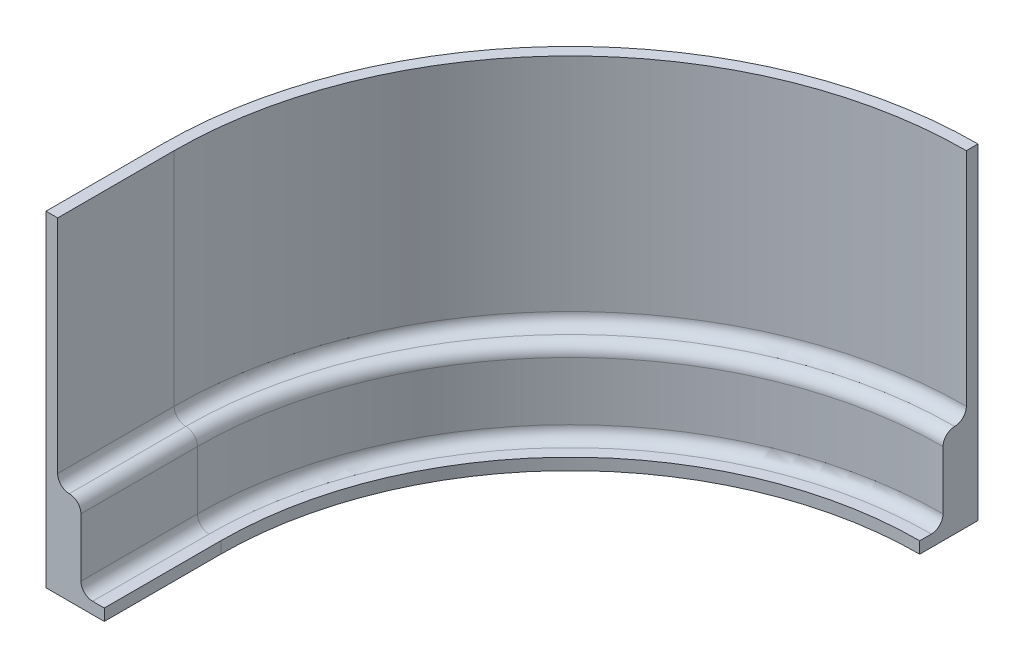
ISO-10303-21;
HEADER;
FILE_DESCRIPTION(('STEP AP214'),'2;1');
FILE_NAME('part.step','',(''),(''),'','','');
FILE_SCHEMA(('AUTOMOTIVE_DESIGN { 1 0 10303 214 1 1 1 1 }'));
ENDSEC;
DATA;
#1=APPLICATION_CONTEXT('core data for automotive mechanical design processes');
#2=APPLICATION_PROTOCOL_DEFINITION('international standard','automotive_design',2000,#1);
#3=PRODUCT_CONTEXT('',#1,'mechanical');
#4=PRODUCT('Part','Part','',(#3));
#5=PRODUCT_RELATED_PRODUCT_CATEGORY('part','',(#4));
#6=PRODUCT_DEFINITION_FORMATION('','',#4);
#7=PRODUCT_DEFINITION_CONTEXT('part definition',#1,'design');
#8=PRODUCT_DEFINITION('design','',#6,#7);
#9=PRODUCT_DEFINITION_SHAPE('','',#8);
#10=(LENGTH_UNIT() NAMED_UNIT(*) SI_UNIT(.MILLI.,.METRE.));
#11=(NAMED_UNIT(*) PLANE_ANGLE_UNIT() SI_UNIT($,.RADIAN.));
#12=(NAMED_UNIT(*) SI_UNIT($,.STERADIAN.) SOLID_ANGLE_UNIT());
#13=UNCERTAINTY_MEASURE_WITH_UNIT(LENGTH_MEASURE(1.E-05),#10,'distance_accuracy_value','');
#14=(GEOMETRIC_REPRESENTATION_CONTEXT(3) GLOBAL_UNCERTAINTY_ASSIGNED_CONTEXT((#13)) GLOBAL_UNIT_ASSIGNED_CONTEXT((#10,
#11,#12)) REPRESENTATION_CONTEXT('',''));
#15=CARTESIAN_POINT('',(0.,0.,0.));
#16=DIRECTION('',(0.,0.,1.));
#17=DIRECTION('',(1.,0.,0.));
#18=AXIS2_PLACEMENT_3D('',#15,#16,#17);
#19=CARTESIAN_POINT('',(150.,5.,0.));
#20=DIRECTION('',(0.,-1.,0.));
#21=DIRECTION('',(0.,0.,-1.));
#22=AXIS2_PLACEMENT_3D('',#19,#20,#21);
#23=PLANE('',#22);
#24=CARTESIAN_POINT('',(150.,5.,0.));
#25=DIRECTION('',(0.,-1.,0.));
#26=DIRECTION('',(0.,0.,-1.));
#27=AXIS2_PLACEMENT_3D('',#24,#25,#26);
#28=CIRCLE('',#27,155.);
#29=CARTESIAN_POINT('',(150.,5.,-155.));
#30=VERTEX_POINT('',#29);
#31=CARTESIAN_POINT('',(-4.99999999999997,5.,0.));
#32=VERTEX_POINT('',#31);
#33=EDGE_CURVE('E188',#30,#32,#28,.F.);
#34=ORIENTED_EDGE('',*,*,#33,.T.);
#35=DIRECTION('',(0.,0.,-1.));
#36=VECTOR('',#35,1.);
#37=CARTESIAN_POINT('',(-5.,5.,50.));
#38=LINE('',#37,#36);
#39=CARTESIAN_POINT('',(-5.,5.,50.));
#40=VERTEX_POINT('',#39);
#41=EDGE_CURVE('E186',#32,#40,#38,.F.);
#42=ORIENTED_EDGE('',*,*,#41,.T.);
#43=DIRECTION('',(1.,0.,0.));
#44=VECTOR('',#43,1.);
#45=CARTESIAN_POINT('',(-25.,5.,50.));
#46=LINE('',#45,#44);
#47=CARTESIAN_POINT('',(0.,5.,50.));
#48=VERTEX_POINT('',#47);
#49=EDGE_CURVE('E227',#40,#48,#46,.T.);
#50=ORIENTED_EDGE('',*,*,#49,.T.);
#51=DIRECTION('',(0.,0.,-1.));
#52=VECTOR('',#51,1.);
#53=CARTESIAN_POINT('',(0.,5.,50.));
#54=LINE('',#53,#52);
#55=CARTESIAN_POINT('',(0.,5.,0.));
#56=VERTEX_POINT('',#55);
#57=EDGE_CURVE('E210',#48,#56,#54,.T.);
#58=ORIENTED_EDGE('',*,*,#57,.T.);
#59=CARTESIAN_POINT('',(150.,5.,0.));
#60=DIRECTION('',(0.,-1.,0.));
#61=DIRECTION('',(0.,0.,-1.));
#62=AXIS2_PLACEMENT_3D('',#59,#60,#61);
#63=CIRCLE('',#62,150.);
#64=CARTESIAN_POINT('',(150.,5.,-150.));
#65=VERTEX_POINT('',#64);
#66=EDGE_CURVE('E213',#56,#65,#63,.T.);
#67=ORIENTED_EDGE('',*,*,#66,.T.);
#68=DIRECTION('',(0.,0.,-1.));
#69=VECTOR('',#68,1.);
#70=CARTESIAN_POINT('',(150.,5.,-150.));
#71=LINE('',#70,#69);
#72=EDGE_CURVE('E229',#65,#30,#71,.T.);
#73=ORIENTED_EDGE('',*,*,#72,.T.);
#74=EDGE_LOOP('',(#34,#42,#50,#58,#67,#73));
#75=FACE_BOUND('',#74,.T.);
#76=ADVANCED_FACE('F33',(#75),#23,.F.);
#77=CARTESIAN_POINT('',(150.,5.,0.));
#78=DIRECTION('',(0.,-1.,0.));
#79=DIRECTION('',(0.,0.,-1.));
#80=AXIS2_PLACEMENT_3D('',#77,#78,#79);
#81=CYLINDRICAL_SURFACE('',#80,150.);
#82=CARTESIAN_POINT('',(150.,0.,0.));
#83=DIRECTION('',(0.,-1.,0.));
#84=DIRECTION('',(0.,0.,-1.));
#85=AXIS2_PLACEMENT_3D('',#82,#83,#84);
#86=CIRCLE('',#85,150.);
#87=CARTESIAN_POINT('',(0.,0.,0.));
#88=VERTEX_POINT('',#87);
#89=CARTESIAN_POINT('',(150.,0.,-150.));
#90=VERTEX_POINT('',#89);
#91=EDGE_CURVE('E222',#88,#90,#86,.T.);
#92=ORIENTED_EDGE('',*,*,#91,.T.);
#93=DIRECTION('',(0.,-1.,0.));
#94=VECTOR('',#93,1.);
#95=CARTESIAN_POINT('',(150.,5.,-150.));
#96=LINE('',#95,#94);
#97=EDGE_CURVE('E194',#65,#90,#96,.T.);
#98=ORIENTED_EDGE('',*,*,#97,.F.);
#99=ORIENTED_EDGE('',*,*,#66,.F.);
#100=DIRECTION('',(0.,-1.,0.));
#101=VECTOR('',#100,1.);
#102=CARTESIAN_POINT('',(0.,5.,0.));
#103=LINE('',#102,#101);
#104=EDGE_CURVE('E207',#56,#88,#103,.T.);
#105=ORIENTED_EDGE('',*,*,#104,.T.);
#106=EDGE_LOOP('',(#92,#98,#99,#105));
#107=FACE_BOUND('',#106,.T.);
#108=ADVANCED_FACE('F292',(#107),#81,.F.);
#109=CARTESIAN_POINT('',(150.,5.,-150.));
#110=DIRECTION('',(-1.,0.,0.));
#111=DIRECTION('',(0.,0.,1.));
#112=AXIS2_PLACEMENT_3D('',#109,#110,#111);
#113=PLANE('',#112);
#114=DIRECTION('',(0.,-1.,0.));
#115=VECTOR('',#114,1.);
#116=CARTESIAN_POINT('',(150.,140.,-170.));
#117=LINE('',#116,#115);
#118=CARTESIAN_POINT('',(150.,140.,-170.));
#119=VERTEX_POINT('',#118);
#120=CARTESIAN_POINT('',(150.,45.,-170.));
#121=VERTEX_POINT('',#120);
#122=EDGE_CURVE('E248',#119,#121,#117,.T.);
#123=ORIENTED_EDGE('',*,*,#122,.T.);
#124=CARTESIAN_POINT('',(150.,45.,-165.));
#125=DIRECTION('',(-1.,0.,0.));
#126=DIRECTION('',(0.,0.,1.));
#127=AXIS2_PLACEMENT_3D('',#124,#125,#126);
#128=CIRCLE('',#127,5.);
#129=CARTESIAN_POINT('',(150.,40.,-165.));
#130=VERTEX_POINT('',#129);
#131=EDGE_CURVE('E11',#121,#130,#128,.T.);
#132=ORIENTED_EDGE('',*,*,#131,.T.);
#133=CARTESIAN_POINT('',(150.,35.,-165.));
#134=DIRECTION('',(-1.,0.,0.));
#135=DIRECTION('',(0.,0.,1.));
#136=AXIS2_PLACEMENT_3D('',#133,#134,#135);
#137=CIRCLE('',#136,5.);
#138=CARTESIAN_POINT('',(150.,35.,-160.));
#139=VERTEX_POINT('',#138);
#140=EDGE_CURVE('E156',#130,#139,#137,.F.);
#141=ORIENTED_EDGE('',*,*,#140,.T.);
#142=DIRECTION('',(0.,-1.,0.));
#143=VECTOR('',#142,1.);
#144=CARTESIAN_POINT('',(150.,40.,-160.));
#145=LINE('',#144,#143);
#146=CARTESIAN_POINT('',(150.,10.,-160.));
#147=VERTEX_POINT('',#146);
#148=EDGE_CURVE('E239',#139,#147,#145,.T.);
#149=ORIENTED_EDGE('',*,*,#148,.T.);
#150=CARTESIAN_POINT('',(150.,10.,-155.));
#151=DIRECTION('',(-1.,0.,0.));
#152=DIRECTION('',(0.,0.,1.));
#153=AXIS2_PLACEMENT_3D('',#150,#151,#152);
#154=CIRCLE('',#153,5.);
#155=EDGE_CURVE('E43',#147,#30,#154,.T.);
#156=ORIENTED_EDGE('',*,*,#155,.T.);
#157=ORIENTED_EDGE('',*,*,#72,.F.);
#158=ORIENTED_EDGE('',*,*,#97,.T.);
#159=DIRECTION('',(0.,0.,-1.));
#160=VECTOR('',#159,1.);
#161=CARTESIAN_POINT('',(150.,0.,-150.));
#162=LINE('',#161,#160);
#163=CARTESIAN_POINT('',(150.,0.,-175.));
#164=VERTEX_POINT('',#163);
#165=EDGE_CURVE('E220',#90,#164,#162,.T.);
#166=ORIENTED_EDGE('',*,*,#165,.T.);
#167=DIRECTION('',(0.,-1.,0.));
#168=VECTOR('',#167,1.);
#169=CARTESIAN_POINT('',(150.,5.,-175.));
#170=LINE('',#169,#168);
#171=CARTESIAN_POINT('',(150.,140.,-175.));
#172=VERTEX_POINT('',#171);
#173=EDGE_CURVE('E197',#172,#164,#170,.T.);
#174=ORIENTED_EDGE('',*,*,#173,.F.);
#175=DIRECTION('',(0.,0.,-1.));
#176=VECTOR('',#175,1.);
#177=CARTESIAN_POINT('',(150.,140.,-170.));
#178=LINE('',#177,#176);
#179=EDGE_CURVE('E250',#119,#172,#178,.T.);
#180=ORIENTED_EDGE('',*,*,#179,.F.);
#181=EDGE_LOOP('',(#123,#132,#141,#149,#156,#157,#158,#166,#174,#180));
#182=FACE_BOUND('',#181,.T.);
#183=ADVANCED_FACE('F290',(#182),#113,.F.);
#184=CARTESIAN_POINT('',(150.,5.,0.));
#185=DIRECTION('',(0.,-1.,0.));
#186=DIRECTION('',(0.,0.,-1.));
#187=AXIS2_PLACEMENT_3D('',#184,#185,#186);
#188=CYLINDRICAL_SURFACE('',#187,175.);
#189=CARTESIAN_POINT('',(150.,0.,0.));
#190=DIRECTION('',(0.,1.,0.));
#191=DIRECTION('',(0.,0.,-1.));
#192=AXIS2_PLACEMENT_3D('',#189,#190,#191);
#193=CIRCLE('',#192,175.);
#194=CARTESIAN_POINT('',(-25.,0.,0.));
#195=VERTEX_POINT('',#194);
#196=EDGE_CURVE('E218',#164,#195,#193,.T.);
#197=ORIENTED_EDGE('',*,*,#196,.T.);
#198=DIRECTION('',(0.,-1.,0.));
#199=VECTOR('',#198,1.);
#200=CARTESIAN_POINT('',(-25.,5.,0.));
#201=LINE('',#200,#199);
#202=CARTESIAN_POINT('',(-25.,140.,0.));
#203=VERTEX_POINT('',#202);
#204=EDGE_CURVE('E136',#203,#195,#201,.T.);
#205=ORIENTED_EDGE('',*,*,#204,.F.);
#206=CARTESIAN_POINT('',(150.,140.,0.));
#207=DIRECTION('',(0.,1.,0.));
#208=DIRECTION('',(0.,0.,1.));
#209=AXIS2_PLACEMENT_3D('',#206,#207,#208);
#210=CIRCLE('',#209,175.);
#211=EDGE_CURVE('E170',#172,#203,#210,.T.);
#212=ORIENTED_EDGE('',*,*,#211,.F.);
#213=ORIENTED_EDGE('',*,*,#173,.T.);
#214=EDGE_LOOP('',(#197,#205,#212,#213));
#215=FACE_BOUND('',#214,.T.);
#216=ADVANCED_FACE('F267',(#215),#188,.T.);
#217=CARTESIAN_POINT('',(-25.,5.,0.));
#218=DIRECTION('',(1.,0.,0.));
#219=DIRECTION('',(0.,0.,-1.));
#220=AXIS2_PLACEMENT_3D('',#217,#218,#219);
#221=PLANE('',#220);
#222=DIRECTION('',(0.,0.,1.));
#223=VECTOR('',#222,1.);
#224=CARTESIAN_POINT('',(-25.,0.,0.));
#225=LINE('',#224,#223);
#226=CARTESIAN_POINT('',(-25.,0.,50.));
#227=VERTEX_POINT('',#226);
#228=EDGE_CURVE('E216',#195,#227,#225,.T.);
#229=ORIENTED_EDGE('',*,*,#228,.T.);
#230=DIRECTION('',(0.,-1.,0.));
#231=VECTOR('',#230,1.);
#232=CARTESIAN_POINT('',(-25.,5.,50.));
#233=LINE('',#232,#231);
#234=CARTESIAN_POINT('',(-25.,140.,50.));
#235=VERTEX_POINT('',#234);
#236=EDGE_CURVE('E201',#235,#227,#233,.T.);
#237=ORIENTED_EDGE('',*,*,#236,.F.);
#238=DIRECTION('',(0.,0.,1.));
#239=VECTOR('',#238,1.);
#240=CARTESIAN_POINT('',(-25.,140.,0.));
#241=LINE('',#240,#239);
#242=EDGE_CURVE('E259',#203,#235,#241,.T.);
#243=ORIENTED_EDGE('',*,*,#242,.F.);
#244=ORIENTED_EDGE('',*,*,#204,.T.);
#245=EDGE_LOOP('',(#229,#237,#243,#244));
#246=FACE_BOUND('',#245,.T.);
#247=ADVANCED_FACE('F276',(#246),#221,.F.);
#248=CARTESIAN_POINT('',(-25.,5.,50.));
#249=DIRECTION('',(0.,0.,-1.));
#250=DIRECTION('',(-1.,0.,0.));
#251=AXIS2_PLACEMENT_3D('',#248,#249,#250);
#252=PLANE('',#251);
#253=DIRECTION('',(0.,-1.,0.));
#254=VECTOR('',#253,1.);
#255=CARTESIAN_POINT('',(-10.,40.,50.));
#256=LINE('',#255,#254);
#257=CARTESIAN_POINT('',(-10.,35.,50.));
#258=VERTEX_POINT('',#257);
#259=CARTESIAN_POINT('',(-10.,10.,50.));
#260=VERTEX_POINT('',#259);
#261=EDGE_CURVE('E225',#258,#260,#256,.T.);
#262=ORIENTED_EDGE('',*,*,#261,.F.);
#263=CARTESIAN_POINT('',(-15.,35.,50.));
#264=DIRECTION('',(0.,0.,-1.));
#265=DIRECTION('',(-1.,0.,0.));
#266=AXIS2_PLACEMENT_3D('',#263,#264,#265);
#267=CIRCLE('',#266,5.);
#268=CARTESIAN_POINT('',(-15.,40.,50.));
#269=VERTEX_POINT('',#268);
#270=EDGE_CURVE('E184',#258,#269,#267,.F.);
#271=ORIENTED_EDGE('',*,*,#270,.T.);
#272=CARTESIAN_POINT('',(-15.,45.,50.));
#273=DIRECTION('',(0.,0.,-1.));
#274=DIRECTION('',(-1.,0.,0.));
#275=AXIS2_PLACEMENT_3D('',#272,#273,#274);
#276=CIRCLE('',#275,5.);
#277=CARTESIAN_POINT('',(-20.,45.,50.));
#278=VERTEX_POINT('',#277);
#279=EDGE_CURVE('E161',#269,#278,#276,.T.);
#280=ORIENTED_EDGE('',*,*,#279,.T.);
#281=DIRECTION('',(0.,-1.,0.));
#282=VECTOR('',#281,1.);
#283=CARTESIAN_POINT('',(-20.,140.,50.));
#284=LINE('',#283,#282);
#285=CARTESIAN_POINT('',(-20.,140.,50.));
#286=VERTEX_POINT('',#285);
#287=EDGE_CURVE('E242',#286,#278,#284,.T.);
#288=ORIENTED_EDGE('',*,*,#287,.F.);
#289=DIRECTION('',(1.,0.,0.));
#290=VECTOR('',#289,1.);
#291=CARTESIAN_POINT('',(-25.,140.,50.));
#292=LINE('',#291,#290);
#293=EDGE_CURVE('E257',#235,#286,#292,.T.);
#294=ORIENTED_EDGE('',*,*,#293,.F.);
#295=ORIENTED_EDGE('',*,*,#236,.T.);
#296=DIRECTION('',(1.,0.,0.));
#297=VECTOR('',#296,1.);
#298=CARTESIAN_POINT('',(-25.,0.,50.));
#299=LINE('',#298,#297);
#300=CARTESIAN_POINT('',(0.,0.,50.));
#301=VERTEX_POINT('',#300);
#302=EDGE_CURVE('E214',#227,#301,#299,.T.);
#303=ORIENTED_EDGE('',*,*,#302,.T.);
#304=DIRECTION('',(0.,-1.,0.));
#305=VECTOR('',#304,1.);
#306=CARTESIAN_POINT('',(0.,5.,50.));
#307=LINE('',#306,#305);
#308=EDGE_CURVE('E204',#48,#301,#307,.T.);
#309=ORIENTED_EDGE('',*,*,#308,.F.);
#310=ORIENTED_EDGE('',*,*,#49,.F.);
#311=CARTESIAN_POINT('',(-5.,10.,50.));
#312=DIRECTION('',(0.,0.,-1.));
#313=DIRECTION('',(-1.,0.,0.));
#314=AXIS2_PLACEMENT_3D('',#311,#312,#313);
#315=CIRCLE('',#314,5.);
#316=EDGE_CURVE('E174',#40,#260,#315,.T.);
#317=ORIENTED_EDGE('',*,*,#316,.T.);
#318=EDGE_LOOP('',(#262,#271,#280,#288,#294,#295,#303,#309,#310,#317));
#319=FACE_BOUND('',#318,.T.);
#320=ADVANCED_FACE('F279',(#319),#252,.F.);
#321=CARTESIAN_POINT('',(0.,5.,50.));
#322=DIRECTION('',(-1.,0.,0.));
#323=DIRECTION('',(0.,0.,1.));
#324=AXIS2_PLACEMENT_3D('',#321,#322,#323);
#325=PLANE('',#324);
#326=DIRECTION('',(0.,0.,-1.));
#327=VECTOR('',#326,1.);
#328=CARTESIAN_POINT('',(0.,0.,50.));
#329=LINE('',#328,#327);
#330=EDGE_CURVE('E211',#301,#88,#329,.T.);
#331=ORIENTED_EDGE('',*,*,#330,.T.);
#332=ORIENTED_EDGE('',*,*,#104,.F.);
#333=ORIENTED_EDGE('',*,*,#57,.F.);
#334=ORIENTED_EDGE('',*,*,#308,.T.);
#335=EDGE_LOOP('',(#331,#332,#333,#334));
#336=FACE_BOUND('',#335,.T.);
#337=ADVANCED_FACE('F312',(#336),#325,.F.);
#338=CARTESIAN_POINT('',(150.,0.,0.));
#339=DIRECTION('',(0.,-1.,0.));
#340=DIRECTION('',(0.,0.,-1.));
#341=AXIS2_PLACEMENT_3D('',#338,#339,#340);
#342=PLANE('',#341);
#343=ORIENTED_EDGE('',*,*,#91,.F.);
#344=ORIENTED_EDGE('',*,*,#330,.F.);
#345=ORIENTED_EDGE('',*,*,#302,.F.);
#346=ORIENTED_EDGE('',*,*,#228,.F.);
#347=ORIENTED_EDGE('',*,*,#196,.F.);
#348=ORIENTED_EDGE('',*,*,#165,.F.);
#349=EDGE_LOOP('',(#343,#344,#345,#346,#347,#348));
#350=FACE_BOUND('',#349,.T.);
#351=ADVANCED_FACE('F272',(#350),#342,.T.);
#352=CARTESIAN_POINT('',(-9.99999999999999,40.,0.));
#353=DIRECTION('',(-1.,0.,0.));
#354=DIRECTION('',(0.,0.,1.));
#355=AXIS2_PLACEMENT_3D('',#352,#353,#354);
#356=PLANE('',#355);
#357=ORIENTED_EDGE('',*,*,#261,.T.);
#358=DIRECTION('',(0.,0.,-1.));
#359=VECTOR('',#358,1.);
#360=CARTESIAN_POINT('',(-9.99999999999999,10.,0.));
#361=LINE('',#360,#359);
#362=CARTESIAN_POINT('',(-9.99999999999999,10.,0.));
#363=VERTEX_POINT('',#362);
#364=EDGE_CURVE('E190',#260,#363,#361,.T.);
#365=ORIENTED_EDGE('',*,*,#364,.T.);
#366=DIRECTION('',(0.,-1.,0.));
#367=VECTOR('',#366,1.);
#368=CARTESIAN_POINT('',(-9.99999999999999,40.,0.));
#369=LINE('',#368,#367);
#370=CARTESIAN_POINT('',(-9.99999999999999,35.,0.));
#371=VERTEX_POINT('',#370);
#372=EDGE_CURVE('E236',#371,#363,#369,.T.);
#373=ORIENTED_EDGE('',*,*,#372,.F.);
#374=DIRECTION('',(0.,0.,-1.));
#375=VECTOR('',#374,1.);
#376=CARTESIAN_POINT('',(-10.,35.,50.));
#377=LINE('',#376,#375);
#378=EDGE_CURVE('E167',#371,#258,#377,.F.);
#379=ORIENTED_EDGE('',*,*,#378,.T.);
#380=EDGE_LOOP('',(#357,#365,#373,#379));
#381=FACE_BOUND('',#380,.T.);
#382=ADVANCED_FACE('F308',(#381),#356,.F.);
#383=CARTESIAN_POINT('',(150.,40.,0.));
#384=DIRECTION('',(0.,-1.,0.));
#385=DIRECTION('',(0.,0.,-1.));
#386=AXIS2_PLACEMENT_3D('',#383,#384,#385);
#387=CYLINDRICAL_SURFACE('',#386,160.);
#388=ORIENTED_EDGE('',*,*,#372,.T.);
#389=CARTESIAN_POINT('',(150.,10.,0.));
#390=DIRECTION('',(0.,-1.,0.));
#391=DIRECTION('',(0.,0.,-1.));
#392=AXIS2_PLACEMENT_3D('',#389,#390,#391);
#393=CIRCLE('',#392,160.);
#394=EDGE_CURVE('E178',#363,#147,#393,.T.);
#395=ORIENTED_EDGE('',*,*,#394,.T.);
#396=ORIENTED_EDGE('',*,*,#148,.F.);
#397=CARTESIAN_POINT('',(150.,35.,0.));
#398=DIRECTION('',(0.,1.,0.));
#399=DIRECTION('',(0.,0.,1.));
#400=AXIS2_PLACEMENT_3D('',#397,#398,#399);
#401=CIRCLE('',#400,160.);
#402=EDGE_CURVE('E180',#139,#371,#401,.T.);
#403=ORIENTED_EDGE('',*,*,#402,.T.);
#404=EDGE_LOOP('',(#388,#395,#396,#403));
#405=FACE_BOUND('',#404,.T.);
#406=ADVANCED_FACE('F343',(#405),#387,.F.);
#407=CARTESIAN_POINT('',(-20.,140.,0.));
#408=DIRECTION('',(-1.,0.,0.));
#409=DIRECTION('',(0.,0.,1.));
#410=AXIS2_PLACEMENT_3D('',#407,#408,#409);
#411=PLANE('',#410);
#412=ORIENTED_EDGE('',*,*,#287,.T.);
#413=DIRECTION('',(0.,0.,-1.));
#414=VECTOR('',#413,1.);
#415=CARTESIAN_POINT('',(-20.,45.,0.));
#416=LINE('',#415,#414);
#417=CARTESIAN_POINT('',(-20.,45.,0.));
#418=VERTEX_POINT('',#417);
#419=EDGE_CURVE('E182',#278,#418,#416,.T.);
#420=ORIENTED_EDGE('',*,*,#419,.T.);
#421=DIRECTION('',(0.,-1.,0.));
#422=VECTOR('',#421,1.);
#423=CARTESIAN_POINT('',(-20.,140.,0.));
#424=LINE('',#423,#422);
#425=CARTESIAN_POINT('',(-20.,140.,0.));
#426=VERTEX_POINT('',#425);
#427=EDGE_CURVE('E245',#426,#418,#424,.T.);
#428=ORIENTED_EDGE('',*,*,#427,.F.);
#429=DIRECTION('',(0.,0.,-1.));
#430=VECTOR('',#429,1.);
#431=CARTESIAN_POINT('',(-20.,140.,0.));
#432=LINE('',#431,#430);
#433=EDGE_CURVE('E255',#286,#426,#432,.T.);
#434=ORIENTED_EDGE('',*,*,#433,.F.);
#435=EDGE_LOOP('',(#412,#420,#428,#434));
#436=FACE_BOUND('',#435,.T.);
#437=ADVANCED_FACE('F287',(#436),#411,.F.);
#438=CARTESIAN_POINT('',(150.,140.,0.));
#439=DIRECTION('',(0.,-1.,0.));
#440=DIRECTION('',(0.,0.,-1.));
#441=AXIS2_PLACEMENT_3D('',#438,#439,#440);
#442=CYLINDRICAL_SURFACE('',#441,170.);
#443=ORIENTED_EDGE('',*,*,#427,.T.);
#444=CARTESIAN_POINT('',(150.,45.,0.));
#445=DIRECTION('',(0.,1.,0.));
#446=DIRECTION('',(0.,0.,1.));
#447=AXIS2_PLACEMENT_3D('',#444,#445,#446);
#448=CIRCLE('',#447,170.);
#449=EDGE_CURVE('E145',#418,#121,#448,.F.);
#450=ORIENTED_EDGE('',*,*,#449,.T.);
#451=ORIENTED_EDGE('',*,*,#122,.F.);
#452=CARTESIAN_POINT('',(150.,140.,0.));
#453=DIRECTION('',(0.,-1.,0.));
#454=DIRECTION('',(0.,0.,1.));
#455=AXIS2_PLACEMENT_3D('',#452,#453,#454);
#456=CIRCLE('',#455,170.);
#457=EDGE_CURVE('E253',#426,#119,#456,.T.);
#458=ORIENTED_EDGE('',*,*,#457,.F.);
#459=EDGE_LOOP('',(#443,#450,#451,#458));
#460=FACE_BOUND('',#459,.T.);
#461=ADVANCED_FACE('F289',(#460),#442,.F.);
#462=CARTESIAN_POINT('',(150.,140.,0.));
#463=DIRECTION('',(0.,1.,0.));
#464=DIRECTION('',(0.,0.,1.));
#465=AXIS2_PLACEMENT_3D('',#462,#463,#464);
#466=PLANE('',#465);
#467=ORIENTED_EDGE('',*,*,#211,.T.);
#468=ORIENTED_EDGE('',*,*,#242,.T.);
#469=ORIENTED_EDGE('',*,*,#293,.T.);
#470=ORIENTED_EDGE('',*,*,#433,.T.);
#471=ORIENTED_EDGE('',*,*,#457,.T.);
#472=ORIENTED_EDGE('',*,*,#179,.T.);
#473=EDGE_LOOP('',(#467,#468,#469,#470,#471,#472));
#474=FACE_BOUND('',#473,.T.);
#475=ADVANCED_FACE('F264',(#474),#466,.T.);
#476=CARTESIAN_POINT('',(150.,10.,0.));
#477=DIRECTION('',(0.,-1.,0.));
#478=DIRECTION('',(0.,0.,-1.));
#479=AXIS2_PLACEMENT_3D('',#476,#477,#478);
#480=TOROIDAL_SURFACE('',#479,155.,5.);
#481=ORIENTED_EDGE('',*,*,#155,.F.);
#482=ORIENTED_EDGE('',*,*,#394,.F.);
#483=CARTESIAN_POINT('',(-4.99999999999997,10.,0.));
#484=DIRECTION('',(0.,0.,-1.));
#485=DIRECTION('',(-1.,0.,0.));
#486=AXIS2_PLACEMENT_3D('',#483,#484,#485);
#487=CIRCLE('',#486,5.);
#488=EDGE_CURVE('E149',#32,#363,#487,.T.);
#489=ORIENTED_EDGE('',*,*,#488,.F.);
#490=ORIENTED_EDGE('',*,*,#33,.F.);
#491=EDGE_LOOP('',(#481,#482,#489,#490));
#492=FACE_BOUND('',#491,.T.);
#493=ADVANCED_FACE('F368',(#492),#480,.F.);
#494=CARTESIAN_POINT('',(-4.99999999999999,10.,0.));
#495=DIRECTION('',(0.,0.,1.));
#496=DIRECTION('',(1.,0.,0.));
#497=AXIS2_PLACEMENT_3D('',#494,#495,#496);
#498=CYLINDRICAL_SURFACE('',#497,5.);
#499=ORIENTED_EDGE('',*,*,#316,.F.);
#500=ORIENTED_EDGE('',*,*,#41,.F.);
#501=ORIENTED_EDGE('',*,*,#488,.T.);
#502=ORIENTED_EDGE('',*,*,#364,.F.);
#503=EDGE_LOOP('',(#499,#500,#501,#502));
#504=FACE_BOUND('',#503,.T.);
#505=ADVANCED_FACE('F374',(#504),#498,.F.);
#506=CARTESIAN_POINT('',(150.,45.,0.));
#507=DIRECTION('',(0.,1.,0.));
#508=DIRECTION('',(0.,0.,1.));
#509=AXIS2_PLACEMENT_3D('',#506,#507,#508);
#510=TOROIDAL_SURFACE('',#509,165.,5.);
#511=ORIENTED_EDGE('',*,*,#131,.F.);
#512=ORIENTED_EDGE('',*,*,#449,.F.);
#513=CARTESIAN_POINT('',(-15.,45.,0.));
#514=DIRECTION('',(0.,0.,-1.));
#515=DIRECTION('',(-1.,0.,0.));
#516=AXIS2_PLACEMENT_3D('',#513,#514,#515);
#517=CIRCLE('',#516,5.);
#518=CARTESIAN_POINT('',(-15.,40.,0.));
#519=VERTEX_POINT('',#518);
#520=EDGE_CURVE('E37',#519,#418,#517,.T.);
#521=ORIENTED_EDGE('',*,*,#520,.F.);
#522=CARTESIAN_POINT('',(150.,40.,0.));
#523=DIRECTION('',(0.,1.,0.));
#524=DIRECTION('',(0.,0.,1.));
#525=AXIS2_PLACEMENT_3D('',#522,#523,#524);
#526=CIRCLE('',#525,165.);
#527=EDGE_CURVE('E143',#130,#519,#526,.T.);
#528=ORIENTED_EDGE('',*,*,#527,.F.);
#529=EDGE_LOOP('',(#511,#512,#521,#528));
#530=FACE_BOUND('',#529,.T.);
#531=ADVANCED_FACE('F35',(#530),#510,.F.);
#532=CARTESIAN_POINT('',(-15.,45.,0.));
#533=DIRECTION('',(0.,0.,-1.));
#534=DIRECTION('',(-1.,0.,0.));
#535=AXIS2_PLACEMENT_3D('',#532,#533,#534);
#536=CYLINDRICAL_SURFACE('',#535,5.);
#537=ORIENTED_EDGE('',*,*,#419,.F.);
#538=ORIENTED_EDGE('',*,*,#279,.F.);
#539=DIRECTION('',(0.,0.,-1.));
#540=VECTOR('',#539,1.);
#541=CARTESIAN_POINT('',(-15.,40.,0.));
#542=LINE('',#541,#540);
#543=EDGE_CURVE('E157',#519,#269,#542,.F.);
#544=ORIENTED_EDGE('',*,*,#543,.F.);
#545=ORIENTED_EDGE('',*,*,#520,.T.);
#546=EDGE_LOOP('',(#537,#538,#544,#545));
#547=FACE_BOUND('',#546,.T.);
#548=ADVANCED_FACE('F160',(#547),#536,.F.);
#549=CARTESIAN_POINT('',(150.,35.,0.));
#550=DIRECTION('',(0.,1.,0.));
#551=DIRECTION('',(0.,0.,1.));
#552=AXIS2_PLACEMENT_3D('',#549,#550,#551);
#553=TOROIDAL_SURFACE('',#552,165.,5.);
#554=ORIENTED_EDGE('',*,*,#140,.F.);
#555=ORIENTED_EDGE('',*,*,#527,.T.);
#556=CARTESIAN_POINT('',(-15.,35.,0.));
#557=DIRECTION('',(0.,0.,1.));
#558=DIRECTION('',(0.,-1.,0.));
#559=AXIS2_PLACEMENT_3D('',#556,#557,#558);
#560=CIRCLE('',#559,5.);
#561=EDGE_CURVE('E155',#371,#519,#560,.T.);
#562=ORIENTED_EDGE('',*,*,#561,.F.);
#563=ORIENTED_EDGE('',*,*,#402,.F.);
#564=EDGE_LOOP('',(#554,#555,#562,#563));
#565=FACE_BOUND('',#564,.T.);
#566=ADVANCED_FACE('F152',(#565),#553,.T.);
#567=CARTESIAN_POINT('',(-15.,35.,0.));
#568=DIRECTION('',(0.,0.,1.));
#569=DIRECTION('',(1.,0.,0.));
#570=AXIS2_PLACEMENT_3D('',#567,#568,#569);
#571=CYLINDRICAL_SURFACE('',#570,5.);
#572=ORIENTED_EDGE('',*,*,#270,.F.);
#573=ORIENTED_EDGE('',*,*,#378,.F.);
#574=ORIENTED_EDGE('',*,*,#561,.T.);
#575=ORIENTED_EDGE('',*,*,#543,.T.);
#576=EDGE_LOOP('',(#572,#573,#574,#575));
#577=FACE_BOUND('',#576,.T.);
#578=ADVANCED_FACE('F165',(#577),#571,.T.);
#579=CLOSED_SHELL('',(#76,#108,#183,#216,#247,#320,#337,#351,#382,#406,#437,#461,#475,#493,#505,
#531,#548,#566,#578));
#580=MANIFOLD_SOLID_BREP('B2',#579);
#581=ADVANCED_BREP_SHAPE_REPRESENTATION('',(#18,#580),#14);
#582=SHAPE_DEFINITION_REPRESENTATION(#9,#581);
ENDSEC;
END-ISO-10303-21;
